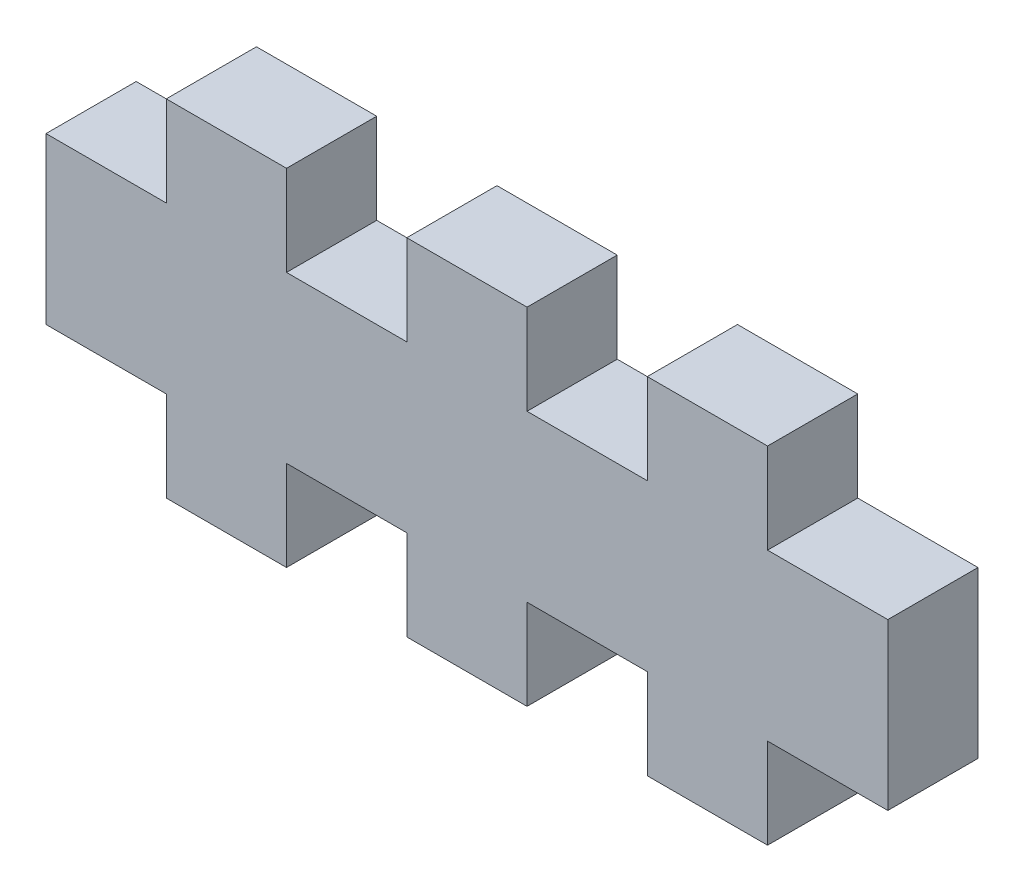
ISO-10303-21;
HEADER;
FILE_DESCRIPTION(('STEP AP214'),'2;1');
FILE_NAME('part.step','',(''),(''),'','','');
FILE_SCHEMA(('AUTOMOTIVE_DESIGN { 1 0 10303 214 1 1 1 1 }'));
ENDSEC;
DATA;
#1=APPLICATION_CONTEXT('core data for automotive mechanical design processes');
#2=APPLICATION_PROTOCOL_DEFINITION('international standard','automotive_design',2000,#1);
#3=PRODUCT_CONTEXT('',#1,'mechanical');
#4=PRODUCT('Part','Part','',(#3));
#5=PRODUCT_RELATED_PRODUCT_CATEGORY('part','',(#4));
#6=PRODUCT_DEFINITION_FORMATION('','',#4);
#7=PRODUCT_DEFINITION_CONTEXT('part definition',#1,'design');
#8=PRODUCT_DEFINITION('design','',#6,#7);
#9=PRODUCT_DEFINITION_SHAPE('','',#8);
#10=(LENGTH_UNIT() NAMED_UNIT(*) SI_UNIT(.MILLI.,.METRE.));
#11=(NAMED_UNIT(*) PLANE_ANGLE_UNIT() SI_UNIT($,.RADIAN.));
#12=(NAMED_UNIT(*) SI_UNIT($,.STERADIAN.) SOLID_ANGLE_UNIT());
#13=UNCERTAINTY_MEASURE_WITH_UNIT(LENGTH_MEASURE(1.E-05),#10,'distance_accuracy_value','');
#14=(GEOMETRIC_REPRESENTATION_CONTEXT(3) GLOBAL_UNCERTAINTY_ASSIGNED_CONTEXT((#13)) GLOBAL_UNIT_ASSIGNED_CONTEXT((#10,
#11,#12)) REPRESENTATION_CONTEXT('',''));
#15=CARTESIAN_POINT('',(0.,0.,0.));
#16=DIRECTION('',(0.,0.,1.));
#17=DIRECTION('',(1.,0.,0.));
#18=AXIS2_PLACEMENT_3D('',#15,#16,#17);
#19=CARTESIAN_POINT('',(-14.,0.,3.));
#20=DIRECTION('',(-1.,0.,0.));
#21=DIRECTION('',(0.,0.,1.));
#22=AXIS2_PLACEMENT_3D('',#19,#20,#21);
#23=PLANE('',#22);
#24=DIRECTION('',(0.,1.,0.));
#25=VECTOR('',#24,1.);
#26=CARTESIAN_POINT('',(-14.,0.,0.));
#27=LINE('',#26,#25);
#28=CARTESIAN_POINT('',(-14.,-2.75000000000001,0.));
#29=VERTEX_POINT('',#28);
#30=CARTESIAN_POINT('',(-14.,2.75,0.));
#31=VERTEX_POINT('',#30);
#32=EDGE_CURVE('E414',#29,#31,#27,.T.);
#33=ORIENTED_EDGE('',*,*,#32,.F.);
#34=DIRECTION('',(0.,0.,-1.));
#35=VECTOR('',#34,1.);
#36=CARTESIAN_POINT('',(-14.,-2.75000000000001,3.));
#37=LINE('',#36,#35);
#38=CARTESIAN_POINT('',(-14.,-2.75000000000001,3.));
#39=VERTEX_POINT('',#38);
#40=EDGE_CURVE('E283',#39,#29,#37,.T.);
#41=ORIENTED_EDGE('',*,*,#40,.F.);
#42=DIRECTION('',(0.,1.,0.));
#43=VECTOR('',#42,1.);
#44=CARTESIAN_POINT('',(-14.,0.,3.));
#45=LINE('',#44,#43);
#46=CARTESIAN_POINT('',(-14.,2.75,3.));
#47=VERTEX_POINT('',#46);
#48=EDGE_CURVE('E399',#39,#47,#45,.T.);
#49=ORIENTED_EDGE('',*,*,#48,.T.);
#50=DIRECTION('',(0.,0.,-1.));
#51=VECTOR('',#50,1.);
#52=CARTESIAN_POINT('',(-14.,2.75,3.));
#53=LINE('',#52,#51);
#54=EDGE_CURVE('E412',#47,#31,#53,.T.);
#55=ORIENTED_EDGE('',*,*,#54,.T.);
#56=EDGE_LOOP('',(#33,#41,#49,#55));
#57=FACE_BOUND('',#56,.T.);
#58=ADVANCED_FACE('F45',(#57),#23,.T.);
#59=CARTESIAN_POINT('',(14.,0.,3.));
#60=DIRECTION('',(-1.,0.,0.));
#61=DIRECTION('',(0.,0.,1.));
#62=AXIS2_PLACEMENT_3D('',#59,#60,#61);
#63=PLANE('',#62);
#64=DIRECTION('',(0.,1.,0.));
#65=VECTOR('',#64,1.);
#66=CARTESIAN_POINT('',(14.,0.,0.));
#67=LINE('',#66,#65);
#68=CARTESIAN_POINT('',(14.,-2.75000000000001,0.));
#69=VERTEX_POINT('',#68);
#70=CARTESIAN_POINT('',(14.,2.75,0.));
#71=VERTEX_POINT('',#70);
#72=EDGE_CURVE('E421',#69,#71,#67,.T.);
#73=ORIENTED_EDGE('',*,*,#72,.T.);
#74=DIRECTION('',(0.,0.,-1.));
#75=VECTOR('',#74,1.);
#76=CARTESIAN_POINT('',(14.,2.75,3.));
#77=LINE('',#76,#75);
#78=CARTESIAN_POINT('',(14.,2.75,3.));
#79=VERTEX_POINT('',#78);
#80=EDGE_CURVE('E435',#79,#71,#77,.T.);
#81=ORIENTED_EDGE('',*,*,#80,.F.);
#82=DIRECTION('',(0.,1.,0.));
#83=VECTOR('',#82,1.);
#84=CARTESIAN_POINT('',(14.,0.,3.));
#85=LINE('',#84,#83);
#86=CARTESIAN_POINT('',(14.,-2.75000000000001,3.));
#87=VERTEX_POINT('',#86);
#88=EDGE_CURVE('E403',#87,#79,#85,.T.);
#89=ORIENTED_EDGE('',*,*,#88,.F.);
#90=DIRECTION('',(0.,0.,-1.));
#91=VECTOR('',#90,1.);
#92=CARTESIAN_POINT('',(14.,-2.75000000000001,3.));
#93=LINE('',#92,#91);
#94=EDGE_CURVE('E439',#87,#69,#93,.T.);
#95=ORIENTED_EDGE('',*,*,#94,.T.);
#96=EDGE_LOOP('',(#73,#81,#89,#95));
#97=FACE_BOUND('',#96,.T.);
#98=ADVANCED_FACE('F567',(#97),#63,.F.);
#99=CARTESIAN_POINT('',(0.,0.,0.));
#100=DIRECTION('',(0.,0.,1.));
#101=DIRECTION('',(1.,0.,0.));
#102=AXIS2_PLACEMENT_3D('',#99,#100,#101);
#103=PLANE('',#102);
#104=ORIENTED_EDGE('',*,*,#32,.T.);
#105=DIRECTION('',(1.,0.,0.));
#106=VECTOR('',#105,1.);
#107=CARTESIAN_POINT('',(0.,2.75,0.));
#108=LINE('',#107,#106);
#109=CARTESIAN_POINT('',(-10.,2.75,0.));
#110=VERTEX_POINT('',#109);
#111=EDGE_CURVE('E427',#31,#110,#108,.T.);
#112=ORIENTED_EDGE('',*,*,#111,.T.);
#113=DIRECTION('',(0.,-1.,0.));
#114=VECTOR('',#113,1.);
#115=CARTESIAN_POINT('',(-10.,5.75,0.));
#116=LINE('',#115,#114);
#117=CARTESIAN_POINT('',(-10.,5.75,0.));
#118=VERTEX_POINT('',#117);
#119=EDGE_CURVE('E450',#118,#110,#116,.T.);
#120=ORIENTED_EDGE('',*,*,#119,.F.);
#121=DIRECTION('',(1.,0.,0.));
#122=VECTOR('',#121,1.);
#123=CARTESIAN_POINT('',(-10.,5.75,0.));
#124=LINE('',#123,#122);
#125=CARTESIAN_POINT('',(-6.00000000000001,5.75,0.));
#126=VERTEX_POINT('',#125);
#127=EDGE_CURVE('E461',#118,#126,#124,.T.);
#128=ORIENTED_EDGE('',*,*,#127,.T.);
#129=DIRECTION('',(0.,-1.,0.));
#130=VECTOR('',#129,1.);
#131=CARTESIAN_POINT('',(-6.00000000000001,5.75,0.));
#132=LINE('',#131,#130);
#133=CARTESIAN_POINT('',(-6.00000000000001,2.75,0.));
#134=VERTEX_POINT('',#133);
#135=EDGE_CURVE('E240',#126,#134,#132,.T.);
#136=ORIENTED_EDGE('',*,*,#135,.T.);
#137=CARTESIAN_POINT('',(-2.00000000000001,2.75,0.));
#138=VERTEX_POINT('',#137);
#139=EDGE_CURVE('E431',#134,#138,#108,.T.);
#140=ORIENTED_EDGE('',*,*,#139,.T.);
#141=DIRECTION('',(0.,-1.,0.));
#142=VECTOR('',#141,1.);
#143=CARTESIAN_POINT('',(-2.00000000000001,5.75,0.));
#144=LINE('',#143,#142);
#145=CARTESIAN_POINT('',(-2.00000000000001,5.75,0.));
#146=VERTEX_POINT('',#145);
#147=EDGE_CURVE('E216',#146,#138,#144,.T.);
#148=ORIENTED_EDGE('',*,*,#147,.F.);
#149=DIRECTION('',(1.,0.,0.));
#150=VECTOR('',#149,1.);
#151=CARTESIAN_POINT('',(-2.00000000000001,5.75,0.));
#152=LINE('',#151,#150);
#153=CARTESIAN_POINT('',(1.99999999999999,5.75,0.));
#154=VERTEX_POINT('',#153);
#155=EDGE_CURVE('E225',#146,#154,#152,.T.);
#156=ORIENTED_EDGE('',*,*,#155,.T.);
#157=DIRECTION('',(0.,-1.,0.));
#158=VECTOR('',#157,1.);
#159=CARTESIAN_POINT('',(1.99999999999999,5.75,0.));
#160=LINE('',#159,#158);
#161=CARTESIAN_POINT('',(1.99999999999999,2.75,0.));
#162=VERTEX_POINT('',#161);
#163=EDGE_CURVE('E229',#154,#162,#160,.T.);
#164=ORIENTED_EDGE('',*,*,#163,.T.);
#165=CARTESIAN_POINT('',(5.99999999999999,2.75,0.));
#166=VERTEX_POINT('',#165);
#167=EDGE_CURVE('E617',#162,#166,#108,.T.);
#168=ORIENTED_EDGE('',*,*,#167,.T.);
#169=DIRECTION('',(0.,-1.,0.));
#170=VECTOR('',#169,1.);
#171=CARTESIAN_POINT('',(5.99999999999999,5.75,0.));
#172=LINE('',#171,#170);
#173=CARTESIAN_POINT('',(5.99999999999999,5.75,0.));
#174=VERTEX_POINT('',#173);
#175=EDGE_CURVE('E256',#174,#166,#172,.T.);
#176=ORIENTED_EDGE('',*,*,#175,.F.);
#177=DIRECTION('',(1.,0.,0.));
#178=VECTOR('',#177,1.);
#179=CARTESIAN_POINT('',(5.99999999999999,5.75,0.));
#180=LINE('',#179,#178);
#181=CARTESIAN_POINT('',(9.99999999999999,5.75,0.));
#182=VERTEX_POINT('',#181);
#183=EDGE_CURVE('E265',#174,#182,#180,.T.);
#184=ORIENTED_EDGE('',*,*,#183,.T.);
#185=DIRECTION('',(0.,-1.,0.));
#186=VECTOR('',#185,1.);
#187=CARTESIAN_POINT('',(9.99999999999999,5.75,0.));
#188=LINE('',#187,#186);
#189=CARTESIAN_POINT('',(9.99999999999999,2.75,0.));
#190=VERTEX_POINT('',#189);
#191=EDGE_CURVE('E269',#182,#190,#188,.T.);
#192=ORIENTED_EDGE('',*,*,#191,.T.);
#193=EDGE_CURVE('E426',#190,#71,#108,.T.);
#194=ORIENTED_EDGE('',*,*,#193,.T.);
#195=ORIENTED_EDGE('',*,*,#72,.F.);
#196=DIRECTION('',(1.,0.,0.));
#197=VECTOR('',#196,1.);
#198=CARTESIAN_POINT('',(0.,-2.75000000000001,0.));
#199=LINE('',#198,#197);
#200=CARTESIAN_POINT('',(9.99999999999999,-2.75000000000001,0.));
#201=VERTEX_POINT('',#200);
#202=EDGE_CURVE('E417',#201,#69,#199,.T.);
#203=ORIENTED_EDGE('',*,*,#202,.F.);
#204=DIRECTION('',(0.,1.,0.));
#205=VECTOR('',#204,1.);
#206=CARTESIAN_POINT('',(9.99999999999999,-5.75000000000001,0.));
#207=LINE('',#206,#205);
#208=CARTESIAN_POINT('',(9.99999999999999,-5.75000000000001,0.));
#209=VERTEX_POINT('',#208);
#210=EDGE_CURVE('E305',#209,#201,#207,.T.);
#211=ORIENTED_EDGE('',*,*,#210,.F.);
#212=DIRECTION('',(1.,0.,0.));
#213=VECTOR('',#212,1.);
#214=CARTESIAN_POINT('',(5.99999999999999,-5.75000000000001,0.));
#215=LINE('',#214,#213);
#216=CARTESIAN_POINT('',(5.99999999999999,-5.75000000000001,0.));
#217=VERTEX_POINT('',#216);
#218=EDGE_CURVE('E294',#217,#209,#215,.T.);
#219=ORIENTED_EDGE('',*,*,#218,.F.);
#220=DIRECTION('',(0.,1.,0.));
#221=VECTOR('',#220,1.);
#222=CARTESIAN_POINT('',(5.99999999999999,-5.75000000000001,0.));
#223=LINE('',#222,#221);
#224=CARTESIAN_POINT('',(5.99999999999999,-2.75000000000001,0.));
#225=VERTEX_POINT('',#224);
#226=EDGE_CURVE('E301',#217,#225,#223,.T.);
#227=ORIENTED_EDGE('',*,*,#226,.T.);
#228=CARTESIAN_POINT('',(1.99999999999999,-2.75000000000001,0.));
#229=VERTEX_POINT('',#228);
#230=EDGE_CURVE('E539',#229,#225,#199,.T.);
#231=ORIENTED_EDGE('',*,*,#230,.F.);
#232=DIRECTION('',(0.,1.,0.));
#233=VECTOR('',#232,1.);
#234=CARTESIAN_POINT('',(1.99999999999999,-5.75000000000001,0.));
#235=LINE('',#234,#233);
#236=CARTESIAN_POINT('',(1.99999999999999,-5.75000000000001,0.));
#237=VERTEX_POINT('',#236);
#238=EDGE_CURVE('E335',#237,#229,#235,.T.);
#239=ORIENTED_EDGE('',*,*,#238,.F.);
#240=DIRECTION('',(1.,0.,0.));
#241=VECTOR('',#240,1.);
#242=CARTESIAN_POINT('',(-2.00000000000001,-5.75000000000001,0.));
#243=LINE('',#242,#241);
#244=CARTESIAN_POINT('',(-2.00000000000001,-5.75000000000001,0.));
#245=VERTEX_POINT('',#244);
#246=EDGE_CURVE('E324',#245,#237,#243,.T.);
#247=ORIENTED_EDGE('',*,*,#246,.F.);
#248=DIRECTION('',(0.,1.,0.));
#249=VECTOR('',#248,1.);
#250=CARTESIAN_POINT('',(-2.00000000000001,-5.75000000000001,0.));
#251=LINE('',#250,#249);
#252=CARTESIAN_POINT('',(-2.00000000000001,-2.75000000000001,0.));
#253=VERTEX_POINT('',#252);
#254=EDGE_CURVE('E154',#245,#253,#251,.T.);
#255=ORIENTED_EDGE('',*,*,#254,.T.);
#256=CARTESIAN_POINT('',(-6.00000000000001,-2.75000000000001,0.));
#257=VERTEX_POINT('',#256);
#258=EDGE_CURVE('E422',#257,#253,#199,.T.);
#259=ORIENTED_EDGE('',*,*,#258,.F.);
#260=DIRECTION('',(0.,1.,0.));
#261=VECTOR('',#260,1.);
#262=CARTESIAN_POINT('',(-6.00000000000001,-5.75000000000001,0.));
#263=LINE('',#262,#261);
#264=CARTESIAN_POINT('',(-6.00000000000001,-5.75000000000001,0.));
#265=VERTEX_POINT('',#264);
#266=EDGE_CURVE('E168',#265,#257,#263,.T.);
#267=ORIENTED_EDGE('',*,*,#266,.F.);
#268=DIRECTION('',(1.,0.,0.));
#269=VECTOR('',#268,1.);
#270=CARTESIAN_POINT('',(-10.,-5.75000000000001,0.));
#271=LINE('',#270,#269);
#272=CARTESIAN_POINT('',(-10.,-5.75000000000001,0.));
#273=VERTEX_POINT('',#272);
#274=EDGE_CURVE('E143',#273,#265,#271,.T.);
#275=ORIENTED_EDGE('',*,*,#274,.F.);
#276=DIRECTION('',(0.,1.,0.));
#277=VECTOR('',#276,1.);
#278=CARTESIAN_POINT('',(-10.,-5.75000000000001,0.));
#279=LINE('',#278,#277);
#280=CARTESIAN_POINT('',(-10.,-2.75000000000001,0.));
#281=VERTEX_POINT('',#280);
#282=EDGE_CURVE('E164',#273,#281,#279,.T.);
#283=ORIENTED_EDGE('',*,*,#282,.T.);
#284=EDGE_CURVE('E418',#29,#281,#199,.T.);
#285=ORIENTED_EDGE('',*,*,#284,.F.);
#286=EDGE_LOOP('',(#104,#112,#120,#128,#136,#140,#148,#156,#164,#168,#176,#184,#192,#194,#195,
#203,#211,#219,#227,#231,#239,#247,#255,#259,#267,#275,#283,#285));
#287=FACE_BOUND('',#286,.T.);
#288=ADVANCED_FACE('F161',(#287),#103,.F.);
#289=CARTESIAN_POINT('',(0.,0.,3.));
#290=DIRECTION('',(0.,0.,1.));
#291=DIRECTION('',(1.,0.,0.));
#292=AXIS2_PLACEMENT_3D('',#289,#290,#291);
#293=PLANE('',#292);
#294=ORIENTED_EDGE('',*,*,#48,.F.);
#295=DIRECTION('',(1.,0.,0.));
#296=VECTOR('',#295,1.);
#297=CARTESIAN_POINT('',(0.,-2.75000000000001,3.));
#298=LINE('',#297,#296);
#299=CARTESIAN_POINT('',(-10.,-2.75000000000001,3.));
#300=VERTEX_POINT('',#299);
#301=EDGE_CURVE('E397',#39,#300,#298,.T.);
#302=ORIENTED_EDGE('',*,*,#301,.T.);
#303=DIRECTION('',(0.,1.,0.));
#304=VECTOR('',#303,1.);
#305=CARTESIAN_POINT('',(-10.,-5.75000000000001,3.));
#306=LINE('',#305,#304);
#307=CARTESIAN_POINT('',(-10.,-5.75000000000001,3.));
#308=VERTEX_POINT('',#307);
#309=EDGE_CURVE('E170',#308,#300,#306,.T.);
#310=ORIENTED_EDGE('',*,*,#309,.F.);
#311=DIRECTION('',(1.,0.,0.));
#312=VECTOR('',#311,1.);
#313=CARTESIAN_POINT('',(-10.,-5.75000000000001,3.));
#314=LINE('',#313,#312);
#315=CARTESIAN_POINT('',(-6.00000000000001,-5.75000000000001,3.));
#316=VERTEX_POINT('',#315);
#317=EDGE_CURVE('E148',#308,#316,#314,.T.);
#318=ORIENTED_EDGE('',*,*,#317,.T.);
#319=DIRECTION('',(0.,1.,0.));
#320=VECTOR('',#319,1.);
#321=CARTESIAN_POINT('',(-6.00000000000001,-5.75000000000001,3.));
#322=LINE('',#321,#320);
#323=CARTESIAN_POINT('',(-6.00000000000001,-2.75000000000001,3.));
#324=VERTEX_POINT('',#323);
#325=EDGE_CURVE('E353',#316,#324,#322,.T.);
#326=ORIENTED_EDGE('',*,*,#325,.T.);
#327=CARTESIAN_POINT('',(-2.00000000000001,-2.75000000000001,3.));
#328=VERTEX_POINT('',#327);
#329=EDGE_CURVE('E392',#324,#328,#298,.T.);
#330=ORIENTED_EDGE('',*,*,#329,.T.);
#331=DIRECTION('',(0.,1.,0.));
#332=VECTOR('',#331,1.);
#333=CARTESIAN_POINT('',(-2.00000000000001,-5.75000000000001,3.));
#334=LINE('',#333,#332);
#335=CARTESIAN_POINT('',(-2.00000000000001,-5.75000000000001,3.));
#336=VERTEX_POINT('',#335);
#337=EDGE_CURVE('E319',#336,#328,#334,.T.);
#338=ORIENTED_EDGE('',*,*,#337,.F.);
#339=DIRECTION('',(1.,0.,0.));
#340=VECTOR('',#339,1.);
#341=CARTESIAN_POINT('',(-2.00000000000001,-5.75000000000001,3.));
#342=LINE('',#341,#340);
#343=CARTESIAN_POINT('',(1.99999999999999,-5.75000000000001,3.));
#344=VERTEX_POINT('',#343);
#345=EDGE_CURVE('E328',#336,#344,#342,.T.);
#346=ORIENTED_EDGE('',*,*,#345,.T.);
#347=DIRECTION('',(0.,1.,0.));
#348=VECTOR('',#347,1.);
#349=CARTESIAN_POINT('',(1.99999999999999,-5.75000000000001,3.));
#350=LINE('',#349,#348);
#351=CARTESIAN_POINT('',(1.99999999999999,-2.75000000000001,3.));
#352=VERTEX_POINT('',#351);
#353=EDGE_CURVE('E323',#344,#352,#350,.T.);
#354=ORIENTED_EDGE('',*,*,#353,.T.);
#355=CARTESIAN_POINT('',(5.99999999999999,-2.75000000000001,3.));
#356=VERTEX_POINT('',#355);
#357=EDGE_CURVE('E386',#352,#356,#298,.T.);
#358=ORIENTED_EDGE('',*,*,#357,.T.);
#359=DIRECTION('',(0.,1.,0.));
#360=VECTOR('',#359,1.);
#361=CARTESIAN_POINT('',(5.99999999999999,-5.75000000000001,3.));
#362=LINE('',#361,#360);
#363=CARTESIAN_POINT('',(5.99999999999999,-5.75000000000001,3.));
#364=VERTEX_POINT('',#363);
#365=EDGE_CURVE('E289',#364,#356,#362,.T.);
#366=ORIENTED_EDGE('',*,*,#365,.F.);
#367=DIRECTION('',(1.,0.,0.));
#368=VECTOR('',#367,1.);
#369=CARTESIAN_POINT('',(5.99999999999999,-5.75000000000001,3.));
#370=LINE('',#369,#368);
#371=CARTESIAN_POINT('',(9.99999999999999,-5.75000000000001,3.));
#372=VERTEX_POINT('',#371);
#373=EDGE_CURVE('E297',#364,#372,#370,.T.);
#374=ORIENTED_EDGE('',*,*,#373,.T.);
#375=DIRECTION('',(0.,1.,0.));
#376=VECTOR('',#375,1.);
#377=CARTESIAN_POINT('',(9.99999999999999,-5.75000000000001,3.));
#378=LINE('',#377,#376);
#379=CARTESIAN_POINT('',(9.99999999999999,-2.75000000000001,3.));
#380=VERTEX_POINT('',#379);
#381=EDGE_CURVE('E293',#372,#380,#378,.T.);
#382=ORIENTED_EDGE('',*,*,#381,.T.);
#383=EDGE_CURVE('E393',#380,#87,#298,.T.);
#384=ORIENTED_EDGE('',*,*,#383,.T.);
#385=ORIENTED_EDGE('',*,*,#88,.T.);
#386=DIRECTION('',(1.,0.,0.));
#387=VECTOR('',#386,1.);
#388=CARTESIAN_POINT('',(0.,2.75,3.));
#389=LINE('',#388,#387);
#390=CARTESIAN_POINT('',(9.99999999999999,2.75,3.));
#391=VERTEX_POINT('',#390);
#392=EDGE_CURVE('E407',#391,#79,#389,.T.);
#393=ORIENTED_EDGE('',*,*,#392,.F.);
#394=DIRECTION('',(0.,-1.,0.));
#395=VECTOR('',#394,1.);
#396=CARTESIAN_POINT('',(9.99999999999999,5.75,3.));
#397=LINE('',#396,#395);
#398=CARTESIAN_POINT('',(9.99999999999999,5.75,3.));
#399=VERTEX_POINT('',#398);
#400=EDGE_CURVE('E255',#399,#391,#397,.T.);
#401=ORIENTED_EDGE('',*,*,#400,.F.);
#402=DIRECTION('',(1.,0.,0.));
#403=VECTOR('',#402,1.);
#404=CARTESIAN_POINT('',(5.99999999999999,5.75,3.));
#405=LINE('',#404,#403);
#406=CARTESIAN_POINT('',(5.99999999999999,5.75,3.));
#407=VERTEX_POINT('',#406);
#408=EDGE_CURVE('E251',#407,#399,#405,.T.);
#409=ORIENTED_EDGE('',*,*,#408,.F.);
#410=DIRECTION('',(0.,-1.,0.));
#411=VECTOR('',#410,1.);
#412=CARTESIAN_POINT('',(5.99999999999999,5.75,3.));
#413=LINE('',#412,#411);
#414=CARTESIAN_POINT('',(5.99999999999999,2.75,3.));
#415=VERTEX_POINT('',#414);
#416=EDGE_CURVE('E260',#407,#415,#413,.T.);
#417=ORIENTED_EDGE('',*,*,#416,.T.);
#418=CARTESIAN_POINT('',(1.99999999999999,2.75,3.));
#419=VERTEX_POINT('',#418);
#420=EDGE_CURVE('E642',#419,#415,#389,.T.);
#421=ORIENTED_EDGE('',*,*,#420,.F.);
#422=DIRECTION('',(0.,-1.,0.));
#423=VECTOR('',#422,1.);
#424=CARTESIAN_POINT('',(1.99999999999999,5.75,3.));
#425=LINE('',#424,#423);
#426=CARTESIAN_POINT('',(1.99999999999999,5.75,3.));
#427=VERTEX_POINT('',#426);
#428=EDGE_CURVE('E215',#427,#419,#425,.T.);
#429=ORIENTED_EDGE('',*,*,#428,.F.);
#430=DIRECTION('',(1.,0.,0.));
#431=VECTOR('',#430,1.);
#432=CARTESIAN_POINT('',(-2.00000000000001,5.75,3.));
#433=LINE('',#432,#431);
#434=CARTESIAN_POINT('',(-2.00000000000001,5.75,3.));
#435=VERTEX_POINT('',#434);
#436=EDGE_CURVE('E211',#435,#427,#433,.T.);
#437=ORIENTED_EDGE('',*,*,#436,.F.);
#438=DIRECTION('',(0.,-1.,0.));
#439=VECTOR('',#438,1.);
#440=CARTESIAN_POINT('',(-2.00000000000001,5.75,3.));
#441=LINE('',#440,#439);
#442=CARTESIAN_POINT('',(-2.00000000000001,2.75,3.));
#443=VERTEX_POINT('',#442);
#444=EDGE_CURVE('E220',#435,#443,#441,.T.);
#445=ORIENTED_EDGE('',*,*,#444,.T.);
#446=CARTESIAN_POINT('',(-6.00000000000001,2.75,3.));
#447=VERTEX_POINT('',#446);
#448=EDGE_CURVE('E413',#447,#443,#389,.T.);
#449=ORIENTED_EDGE('',*,*,#448,.F.);
#450=DIRECTION('',(0.,-1.,0.));
#451=VECTOR('',#450,1.);
#452=CARTESIAN_POINT('',(-6.00000000000001,5.75,3.));
#453=LINE('',#452,#451);
#454=CARTESIAN_POINT('',(-6.00000000000001,5.75,3.));
#455=VERTEX_POINT('',#454);
#456=EDGE_CURVE('E446',#455,#447,#453,.T.);
#457=ORIENTED_EDGE('',*,*,#456,.F.);
#458=DIRECTION('',(1.,0.,0.));
#459=VECTOR('',#458,1.);
#460=CARTESIAN_POINT('',(-10.,5.75,3.));
#461=LINE('',#460,#459);
#462=CARTESIAN_POINT('',(-10.,5.75,3.));
#463=VERTEX_POINT('',#462);
#464=EDGE_CURVE('E449',#463,#455,#461,.T.);
#465=ORIENTED_EDGE('',*,*,#464,.F.);
#466=DIRECTION('',(0.,-1.,0.));
#467=VECTOR('',#466,1.);
#468=CARTESIAN_POINT('',(-10.,5.75,3.));
#469=LINE('',#468,#467);
#470=CARTESIAN_POINT('',(-10.,2.75,3.));
#471=VERTEX_POINT('',#470);
#472=EDGE_CURVE('E454',#463,#471,#469,.T.);
#473=ORIENTED_EDGE('',*,*,#472,.T.);
#474=EDGE_CURVE('E408',#47,#471,#389,.T.);
#475=ORIENTED_EDGE('',*,*,#474,.F.);
#476=EDGE_LOOP('',(#294,#302,#310,#318,#326,#330,#338,#346,#354,#358,#366,#374,#382,#384,#385,
#393,#401,#409,#417,#421,#429,#437,#445,#449,#457,#465,#473,#475));
#477=FACE_BOUND('',#476,.T.);
#478=ADVANCED_FACE('F362',(#477),#293,.T.);
#479=CARTESIAN_POINT('',(0.,2.75,3.));
#480=DIRECTION('',(0.,1.,0.));
#481=DIRECTION('',(-1.,0.,0.));
#482=AXIS2_PLACEMENT_3D('',#479,#480,#481);
#483=PLANE('',#482);
#484=DIRECTION('',(0.,0.,-1.));
#485=VECTOR('',#484,1.);
#486=CARTESIAN_POINT('',(1.99999999999999,2.75,3.));
#487=LINE('',#486,#485);
#488=EDGE_CURVE('E205',#419,#162,#487,.T.);
#489=ORIENTED_EDGE('',*,*,#488,.F.);
#490=ORIENTED_EDGE('',*,*,#420,.T.);
#491=DIRECTION('',(0.,0.,-1.));
#492=VECTOR('',#491,1.);
#493=CARTESIAN_POINT('',(5.99999999999999,2.75,3.));
#494=LINE('',#493,#492);
#495=EDGE_CURVE('E279',#415,#166,#494,.T.);
#496=ORIENTED_EDGE('',*,*,#495,.T.);
#497=ORIENTED_EDGE('',*,*,#167,.F.);
#498=EDGE_LOOP('',(#489,#490,#496,#497));
#499=FACE_BOUND('',#498,.T.);
#500=ADVANCED_FACE('F641',(#499),#483,.T.);
#501=DIRECTION('',(0.,0.,-1.));
#502=VECTOR('',#501,1.);
#503=CARTESIAN_POINT('',(9.99999999999999,2.75,3.));
#504=LINE('',#503,#502);
#505=EDGE_CURVE('E245',#391,#190,#504,.T.);
#506=ORIENTED_EDGE('',*,*,#505,.F.);
#507=ORIENTED_EDGE('',*,*,#392,.T.);
#508=ORIENTED_EDGE('',*,*,#80,.T.);
#509=ORIENTED_EDGE('',*,*,#193,.F.);
#510=EDGE_LOOP('',(#506,#507,#508,#509));
#511=FACE_BOUND('',#510,.T.);
#512=ADVANCED_FACE('F625',(#511),#483,.T.);
#513=DIRECTION('',(0.,0.,-1.));
#514=VECTOR('',#513,1.);
#515=CARTESIAN_POINT('',(-6.00000000000001,2.75,3.));
#516=LINE('',#515,#514);
#517=EDGE_CURVE('E185',#447,#134,#516,.T.);
#518=ORIENTED_EDGE('',*,*,#517,.F.);
#519=ORIENTED_EDGE('',*,*,#448,.T.);
#520=DIRECTION('',(0.,0.,-1.));
#521=VECTOR('',#520,1.);
#522=CARTESIAN_POINT('',(-2.00000000000001,2.75,3.));
#523=LINE('',#522,#521);
#524=EDGE_CURVE('E241',#443,#138,#523,.T.);
#525=ORIENTED_EDGE('',*,*,#524,.T.);
#526=ORIENTED_EDGE('',*,*,#139,.F.);
#527=EDGE_LOOP('',(#518,#519,#525,#526));
#528=FACE_BOUND('',#527,.T.);
#529=ADVANCED_FACE('F634',(#528),#483,.T.);
#530=ORIENTED_EDGE('',*,*,#474,.T.);
#531=DIRECTION('',(0.,0.,-1.));
#532=VECTOR('',#531,1.);
#533=CARTESIAN_POINT('',(-10.,2.75,3.));
#534=LINE('',#533,#532);
#535=EDGE_CURVE('E195',#471,#110,#534,.T.);
#536=ORIENTED_EDGE('',*,*,#535,.T.);
#537=ORIENTED_EDGE('',*,*,#111,.F.);
#538=ORIENTED_EDGE('',*,*,#54,.F.);
#539=EDGE_LOOP('',(#530,#536,#537,#538));
#540=FACE_BOUND('',#539,.T.);
#541=ADVANCED_FACE('F648',(#540),#483,.T.);
#542=CARTESIAN_POINT('',(0.,-2.75000000000001,3.));
#543=DIRECTION('',(0.,1.,0.));
#544=DIRECTION('',(-1.,0.,0.));
#545=AXIS2_PLACEMENT_3D('',#542,#543,#544);
#546=PLANE('',#545);
#547=DIRECTION('',(0.,0.,-1.));
#548=VECTOR('',#547,1.);
#549=CARTESIAN_POINT('',(-2.00000000000001,-2.75000000000001,3.));
#550=LINE('',#549,#548);
#551=EDGE_CURVE('E317',#328,#253,#550,.T.);
#552=ORIENTED_EDGE('',*,*,#551,.F.);
#553=ORIENTED_EDGE('',*,*,#329,.F.);
#554=DIRECTION('',(0.,0.,-1.));
#555=VECTOR('',#554,1.);
#556=CARTESIAN_POINT('',(-6.00000000000001,-2.75000000000001,3.));
#557=LINE('',#556,#555);
#558=EDGE_CURVE('E182',#324,#257,#557,.T.);
#559=ORIENTED_EDGE('',*,*,#558,.T.);
#560=ORIENTED_EDGE('',*,*,#258,.T.);
#561=EDGE_LOOP('',(#552,#553,#559,#560));
#562=FACE_BOUND('',#561,.T.);
#563=ADVANCED_FACE('F542',(#562),#546,.F.);
#564=DIRECTION('',(0.,0.,-1.));
#565=VECTOR('',#564,1.);
#566=CARTESIAN_POINT('',(-10.,-2.75000000000001,3.));
#567=LINE('',#566,#565);
#568=EDGE_CURVE('E49',#300,#281,#567,.T.);
#569=ORIENTED_EDGE('',*,*,#568,.F.);
#570=ORIENTED_EDGE('',*,*,#301,.F.);
#571=ORIENTED_EDGE('',*,*,#40,.T.);
#572=ORIENTED_EDGE('',*,*,#284,.T.);
#573=EDGE_LOOP('',(#569,#570,#571,#572));
#574=FACE_BOUND('',#573,.T.);
#575=ADVANCED_FACE('F609',(#574),#546,.F.);
#576=DIRECTION('',(0.,0.,-1.));
#577=VECTOR('',#576,1.);
#578=CARTESIAN_POINT('',(5.99999999999999,-2.75000000000001,3.));
#579=LINE('',#578,#577);
#580=EDGE_CURVE('E11',#356,#225,#579,.T.);
#581=ORIENTED_EDGE('',*,*,#580,.F.);
#582=ORIENTED_EDGE('',*,*,#357,.F.);
#583=DIRECTION('',(0.,0.,-1.));
#584=VECTOR('',#583,1.);
#585=CARTESIAN_POINT('',(1.99999999999999,-2.75000000000001,3.));
#586=LINE('',#585,#584);
#587=EDGE_CURVE('E193',#352,#229,#586,.T.);
#588=ORIENTED_EDGE('',*,*,#587,.T.);
#589=ORIENTED_EDGE('',*,*,#230,.T.);
#590=EDGE_LOOP('',(#581,#582,#588,#589));
#591=FACE_BOUND('',#590,.T.);
#592=ADVANCED_FACE('F390',(#591),#546,.F.);
#593=ORIENTED_EDGE('',*,*,#383,.F.);
#594=DIRECTION('',(0.,0.,-1.));
#595=VECTOR('',#594,1.);
#596=CARTESIAN_POINT('',(9.99999999999999,-2.75000000000001,3.));
#597=LINE('',#596,#595);
#598=EDGE_CURVE('E56',#380,#201,#597,.T.);
#599=ORIENTED_EDGE('',*,*,#598,.T.);
#600=ORIENTED_EDGE('',*,*,#202,.T.);
#601=ORIENTED_EDGE('',*,*,#94,.F.);
#602=EDGE_LOOP('',(#593,#599,#600,#601));
#603=FACE_BOUND('',#602,.T.);
#604=ADVANCED_FACE('F528',(#603),#546,.F.);
#605=CARTESIAN_POINT('',(5.99999999999999,5.75,3.));
#606=DIRECTION('',(0.,1.,0.));
#607=DIRECTION('',(0.,0.,1.));
#608=AXIS2_PLACEMENT_3D('',#605,#606,#607);
#609=PLANE('',#608);
#610=ORIENTED_EDGE('',*,*,#183,.F.);
#611=DIRECTION('',(0.,0.,-1.));
#612=VECTOR('',#611,1.);
#613=CARTESIAN_POINT('',(5.99999999999999,5.75,3.));
#614=LINE('',#613,#612);
#615=EDGE_CURVE('E230',#407,#174,#614,.T.);
#616=ORIENTED_EDGE('',*,*,#615,.F.);
#617=ORIENTED_EDGE('',*,*,#408,.T.);
#618=DIRECTION('',(0.,0.,-1.));
#619=VECTOR('',#618,1.);
#620=CARTESIAN_POINT('',(9.99999999999999,5.75,3.));
#621=LINE('',#620,#619);
#622=EDGE_CURVE('E264',#399,#182,#621,.T.);
#623=ORIENTED_EDGE('',*,*,#622,.T.);
#624=EDGE_LOOP('',(#610,#616,#617,#623));
#625=FACE_BOUND('',#624,.T.);
#626=ADVANCED_FACE('F600',(#625),#609,.T.);
#627=CARTESIAN_POINT('',(5.99999999999999,5.75,3.));
#628=DIRECTION('',(1.,0.,0.));
#629=DIRECTION('',(0.,0.,-1.));
#630=AXIS2_PLACEMENT_3D('',#627,#628,#629);
#631=PLANE('',#630);
#632=ORIENTED_EDGE('',*,*,#175,.T.);
#633=ORIENTED_EDGE('',*,*,#495,.F.);
#634=ORIENTED_EDGE('',*,*,#416,.F.);
#635=ORIENTED_EDGE('',*,*,#615,.T.);
#636=EDGE_LOOP('',(#632,#633,#634,#635));
#637=FACE_BOUND('',#636,.T.);
#638=ADVANCED_FACE('F597',(#637),#631,.F.);
#639=CARTESIAN_POINT('',(9.99999999999999,5.75,3.));
#640=DIRECTION('',(1.,0.,0.));
#641=DIRECTION('',(0.,0.,-1.));
#642=AXIS2_PLACEMENT_3D('',#639,#640,#641);
#643=PLANE('',#642);
#644=ORIENTED_EDGE('',*,*,#191,.F.);
#645=ORIENTED_EDGE('',*,*,#622,.F.);
#646=ORIENTED_EDGE('',*,*,#400,.T.);
#647=ORIENTED_EDGE('',*,*,#505,.T.);
#648=EDGE_LOOP('',(#644,#645,#646,#647));
#649=FACE_BOUND('',#648,.T.);
#650=ADVANCED_FACE('F595',(#649),#643,.T.);
#651=CARTESIAN_POINT('',(-2.00000000000001,5.75,3.));
#652=DIRECTION('',(0.,1.,0.));
#653=DIRECTION('',(0.,0.,1.));
#654=AXIS2_PLACEMENT_3D('',#651,#652,#653);
#655=PLANE('',#654);
#656=ORIENTED_EDGE('',*,*,#155,.F.);
#657=DIRECTION('',(0.,0.,-1.));
#658=VECTOR('',#657,1.);
#659=CARTESIAN_POINT('',(-2.00000000000001,5.75,3.));
#660=LINE('',#659,#658);
#661=EDGE_CURVE('E237',#435,#146,#660,.T.);
#662=ORIENTED_EDGE('',*,*,#661,.F.);
#663=ORIENTED_EDGE('',*,*,#436,.T.);
#664=DIRECTION('',(0.,0.,-1.));
#665=VECTOR('',#664,1.);
#666=CARTESIAN_POINT('',(1.99999999999999,5.75,3.));
#667=LINE('',#666,#665);
#668=EDGE_CURVE('E224',#427,#154,#667,.T.);
#669=ORIENTED_EDGE('',*,*,#668,.T.);
#670=EDGE_LOOP('',(#656,#662,#663,#669));
#671=FACE_BOUND('',#670,.T.);
#672=ADVANCED_FACE('F588',(#671),#655,.T.);
#673=CARTESIAN_POINT('',(-2.00000000000001,5.75,3.));
#674=DIRECTION('',(1.,0.,0.));
#675=DIRECTION('',(0.,0.,-1.));
#676=AXIS2_PLACEMENT_3D('',#673,#674,#675);
#677=PLANE('',#676);
#678=ORIENTED_EDGE('',*,*,#147,.T.);
#679=ORIENTED_EDGE('',*,*,#524,.F.);
#680=ORIENTED_EDGE('',*,*,#444,.F.);
#681=ORIENTED_EDGE('',*,*,#661,.T.);
#682=EDGE_LOOP('',(#678,#679,#680,#681));
#683=FACE_BOUND('',#682,.T.);
#684=ADVANCED_FACE('F585',(#683),#677,.F.);
#685=CARTESIAN_POINT('',(1.99999999999999,5.75,3.));
#686=DIRECTION('',(1.,0.,0.));
#687=DIRECTION('',(0.,1.,0.));
#688=AXIS2_PLACEMENT_3D('',#685,#686,#687);
#689=PLANE('',#688);
#690=ORIENTED_EDGE('',*,*,#163,.F.);
#691=ORIENTED_EDGE('',*,*,#668,.F.);
#692=ORIENTED_EDGE('',*,*,#428,.T.);
#693=ORIENTED_EDGE('',*,*,#488,.T.);
#694=EDGE_LOOP('',(#690,#691,#692,#693));
#695=FACE_BOUND('',#694,.T.);
#696=ADVANCED_FACE('F582',(#695),#689,.T.);
#697=CARTESIAN_POINT('',(-10.,5.75,3.));
#698=DIRECTION('',(0.,1.,0.));
#699=DIRECTION('',(0.,0.,1.));
#700=AXIS2_PLACEMENT_3D('',#697,#698,#699);
#701=PLANE('',#700);
#702=ORIENTED_EDGE('',*,*,#127,.F.);
#703=DIRECTION('',(0.,0.,-1.));
#704=VECTOR('',#703,1.);
#705=CARTESIAN_POINT('',(-10.,5.75,3.));
#706=LINE('',#705,#704);
#707=EDGE_CURVE('E458',#463,#118,#706,.T.);
#708=ORIENTED_EDGE('',*,*,#707,.F.);
#709=ORIENTED_EDGE('',*,*,#464,.T.);
#710=DIRECTION('',(0.,0.,-1.));
#711=VECTOR('',#710,1.);
#712=CARTESIAN_POINT('',(-6.00000000000001,5.75,3.));
#713=LINE('',#712,#711);
#714=EDGE_CURVE('E209',#455,#126,#713,.T.);
#715=ORIENTED_EDGE('',*,*,#714,.T.);
#716=EDGE_LOOP('',(#702,#708,#709,#715));
#717=FACE_BOUND('',#716,.T.);
#718=ADVANCED_FACE('F474',(#717),#701,.T.);
#719=CARTESIAN_POINT('',(-10.,5.75,3.));
#720=DIRECTION('',(1.,0.,0.));
#721=DIRECTION('',(0.,0.,-1.));
#722=AXIS2_PLACEMENT_3D('',#719,#720,#721);
#723=PLANE('',#722);
#724=ORIENTED_EDGE('',*,*,#119,.T.);
#725=ORIENTED_EDGE('',*,*,#535,.F.);
#726=ORIENTED_EDGE('',*,*,#472,.F.);
#727=ORIENTED_EDGE('',*,*,#707,.T.);
#728=EDGE_LOOP('',(#724,#725,#726,#727));
#729=FACE_BOUND('',#728,.T.);
#730=ADVANCED_FACE('F483',(#729),#723,.F.);
#731=CARTESIAN_POINT('',(-6.00000000000001,5.75,3.));
#732=DIRECTION('',(1.,0.,0.));
#733=DIRECTION('',(0.,1.,0.));
#734=AXIS2_PLACEMENT_3D('',#731,#732,#733);
#735=PLANE('',#734);
#736=ORIENTED_EDGE('',*,*,#135,.F.);
#737=ORIENTED_EDGE('',*,*,#714,.F.);
#738=ORIENTED_EDGE('',*,*,#456,.T.);
#739=ORIENTED_EDGE('',*,*,#517,.T.);
#740=EDGE_LOOP('',(#736,#737,#738,#739));
#741=FACE_BOUND('',#740,.T.);
#742=ADVANCED_FACE('F477',(#741),#735,.T.);
#743=CARTESIAN_POINT('',(-10.,-5.75000000000001,3.));
#744=DIRECTION('',(0.,1.,0.));
#745=DIRECTION('',(0.,0.,1.));
#746=AXIS2_PLACEMENT_3D('',#743,#744,#745);
#747=PLANE('',#746);
#748=ORIENTED_EDGE('',*,*,#274,.T.);
#749=DIRECTION('',(0.,0.,-1.));
#750=VECTOR('',#749,1.);
#751=CARTESIAN_POINT('',(-6.00000000000001,-5.75000000000001,3.));
#752=LINE('',#751,#750);
#753=EDGE_CURVE('E155',#316,#265,#752,.T.);
#754=ORIENTED_EDGE('',*,*,#753,.F.);
#755=ORIENTED_EDGE('',*,*,#317,.F.);
#756=DIRECTION('',(0.,0.,-1.));
#757=VECTOR('',#756,1.);
#758=CARTESIAN_POINT('',(-10.,-5.75000000000001,3.));
#759=LINE('',#758,#757);
#760=EDGE_CURVE('E146',#308,#273,#759,.T.);
#761=ORIENTED_EDGE('',*,*,#760,.T.);
#762=EDGE_LOOP('',(#748,#754,#755,#761));
#763=FACE_BOUND('',#762,.T.);
#764=ADVANCED_FACE('F147',(#763),#747,.F.);
#765=CARTESIAN_POINT('',(-6.00000000000001,-5.75000000000001,3.));
#766=DIRECTION('',(-1.,0.,0.));
#767=DIRECTION('',(0.,-1.,0.));
#768=AXIS2_PLACEMENT_3D('',#765,#766,#767);
#769=PLANE('',#768);
#770=ORIENTED_EDGE('',*,*,#266,.T.);
#771=ORIENTED_EDGE('',*,*,#558,.F.);
#772=ORIENTED_EDGE('',*,*,#325,.F.);
#773=ORIENTED_EDGE('',*,*,#753,.T.);
#774=EDGE_LOOP('',(#770,#771,#772,#773));
#775=FACE_BOUND('',#774,.T.);
#776=ADVANCED_FACE('F365',(#775),#769,.F.);
#777=CARTESIAN_POINT('',(-10.,-5.75000000000001,3.));
#778=DIRECTION('',(-1.,0.,0.));
#779=DIRECTION('',(0.,0.,1.));
#780=AXIS2_PLACEMENT_3D('',#777,#778,#779);
#781=PLANE('',#780);
#782=ORIENTED_EDGE('',*,*,#282,.F.);
#783=ORIENTED_EDGE('',*,*,#760,.F.);
#784=ORIENTED_EDGE('',*,*,#309,.T.);
#785=ORIENTED_EDGE('',*,*,#568,.T.);
#786=EDGE_LOOP('',(#782,#783,#784,#785));
#787=FACE_BOUND('',#786,.T.);
#788=ADVANCED_FACE('F47',(#787),#781,.T.);
#789=CARTESIAN_POINT('',(-2.00000000000001,-5.75000000000001,3.));
#790=DIRECTION('',(0.,1.,0.));
#791=DIRECTION('',(0.,0.,1.));
#792=AXIS2_PLACEMENT_3D('',#789,#790,#791);
#793=PLANE('',#792);
#794=ORIENTED_EDGE('',*,*,#246,.T.);
#795=DIRECTION('',(0.,0.,-1.));
#796=VECTOR('',#795,1.);
#797=CARTESIAN_POINT('',(1.99999999999999,-5.75000000000001,3.));
#798=LINE('',#797,#796);
#799=EDGE_CURVE('E331',#344,#237,#798,.T.);
#800=ORIENTED_EDGE('',*,*,#799,.F.);
#801=ORIENTED_EDGE('',*,*,#345,.F.);
#802=DIRECTION('',(0.,0.,-1.));
#803=VECTOR('',#802,1.);
#804=CARTESIAN_POINT('',(-2.00000000000001,-5.75000000000001,3.));
#805=LINE('',#804,#803);
#806=EDGE_CURVE('E306',#336,#245,#805,.T.);
#807=ORIENTED_EDGE('',*,*,#806,.T.);
#808=EDGE_LOOP('',(#794,#800,#801,#807));
#809=FACE_BOUND('',#808,.T.);
#810=ADVANCED_FACE('F548',(#809),#793,.F.);
#811=CARTESIAN_POINT('',(1.99999999999999,-5.75000000000001,3.));
#812=DIRECTION('',(-1.,0.,0.));
#813=DIRECTION('',(0.,-1.,0.));
#814=AXIS2_PLACEMENT_3D('',#811,#812,#813);
#815=PLANE('',#814);
#816=ORIENTED_EDGE('',*,*,#238,.T.);
#817=ORIENTED_EDGE('',*,*,#587,.F.);
#818=ORIENTED_EDGE('',*,*,#353,.F.);
#819=ORIENTED_EDGE('',*,*,#799,.T.);
#820=EDGE_LOOP('',(#816,#817,#818,#819));
#821=FACE_BOUND('',#820,.T.);
#822=ADVANCED_FACE('F377',(#821),#815,.F.);
#823=CARTESIAN_POINT('',(-2.00000000000001,-5.75000000000001,3.));
#824=DIRECTION('',(-1.,0.,0.));
#825=DIRECTION('',(0.,0.,1.));
#826=AXIS2_PLACEMENT_3D('',#823,#824,#825);
#827=PLANE('',#826);
#828=ORIENTED_EDGE('',*,*,#254,.F.);
#829=ORIENTED_EDGE('',*,*,#806,.F.);
#830=ORIENTED_EDGE('',*,*,#337,.T.);
#831=ORIENTED_EDGE('',*,*,#551,.T.);
#832=EDGE_LOOP('',(#828,#829,#830,#831));
#833=FACE_BOUND('',#832,.T.);
#834=ADVANCED_FACE('F546',(#833),#827,.T.);
#835=CARTESIAN_POINT('',(5.99999999999999,-5.75000000000001,3.));
#836=DIRECTION('',(0.,1.,0.));
#837=DIRECTION('',(0.,0.,1.));
#838=AXIS2_PLACEMENT_3D('',#835,#836,#837);
#839=PLANE('',#838);
#840=ORIENTED_EDGE('',*,*,#218,.T.);
#841=DIRECTION('',(0.,0.,-1.));
#842=VECTOR('',#841,1.);
#843=CARTESIAN_POINT('',(9.99999999999999,-5.75000000000001,3.));
#844=LINE('',#843,#842);
#845=EDGE_CURVE('E300',#372,#209,#844,.T.);
#846=ORIENTED_EDGE('',*,*,#845,.F.);
#847=ORIENTED_EDGE('',*,*,#373,.F.);
#848=DIRECTION('',(0.,0.,-1.));
#849=VECTOR('',#848,1.);
#850=CARTESIAN_POINT('',(5.99999999999999,-5.75000000000001,3.));
#851=LINE('',#850,#849);
#852=EDGE_CURVE('E270',#364,#217,#851,.T.);
#853=ORIENTED_EDGE('',*,*,#852,.T.);
#854=EDGE_LOOP('',(#840,#846,#847,#853));
#855=FACE_BOUND('',#854,.T.);
#856=ADVANCED_FACE('F554',(#855),#839,.F.);
#857=CARTESIAN_POINT('',(9.99999999999999,-5.75000000000001,3.));
#858=DIRECTION('',(-1.,0.,0.));
#859=DIRECTION('',(0.,0.,1.));
#860=AXIS2_PLACEMENT_3D('',#857,#858,#859);
#861=PLANE('',#860);
#862=ORIENTED_EDGE('',*,*,#210,.T.);
#863=ORIENTED_EDGE('',*,*,#598,.F.);
#864=ORIENTED_EDGE('',*,*,#381,.F.);
#865=ORIENTED_EDGE('',*,*,#845,.T.);
#866=EDGE_LOOP('',(#862,#863,#864,#865));
#867=FACE_BOUND('',#866,.T.);
#868=ADVANCED_FACE('F533',(#867),#861,.F.);
#869=CARTESIAN_POINT('',(5.99999999999999,-5.75000000000001,3.));
#870=DIRECTION('',(-1.,0.,0.));
#871=DIRECTION('',(0.,0.,1.));
#872=AXIS2_PLACEMENT_3D('',#869,#870,#871);
#873=PLANE('',#872);
#874=ORIENTED_EDGE('',*,*,#226,.F.);
#875=ORIENTED_EDGE('',*,*,#852,.F.);
#876=ORIENTED_EDGE('',*,*,#365,.T.);
#877=ORIENTED_EDGE('',*,*,#580,.T.);
#878=EDGE_LOOP('',(#874,#875,#876,#877));
#879=FACE_BOUND('',#878,.T.);
#880=ADVANCED_FACE('F551',(#879),#873,.T.);
#881=CLOSED_SHELL('',(#58,#98,#288,#478,#500,#512,#529,#541,#563,#575,#592,#604,#626,#638,#650,
#672,#684,#696,#718,#730,#742,#764,#776,#788,#810,#822,#834,#856,#868,#880));
#882=MANIFOLD_SOLID_BREP('B2',#881);
#883=ADVANCED_BREP_SHAPE_REPRESENTATION('',(#18,#882),#14);
#884=SHAPE_DEFINITION_REPRESENTATION(#9,#883);
ENDSEC;
END-ISO-10303-21;
